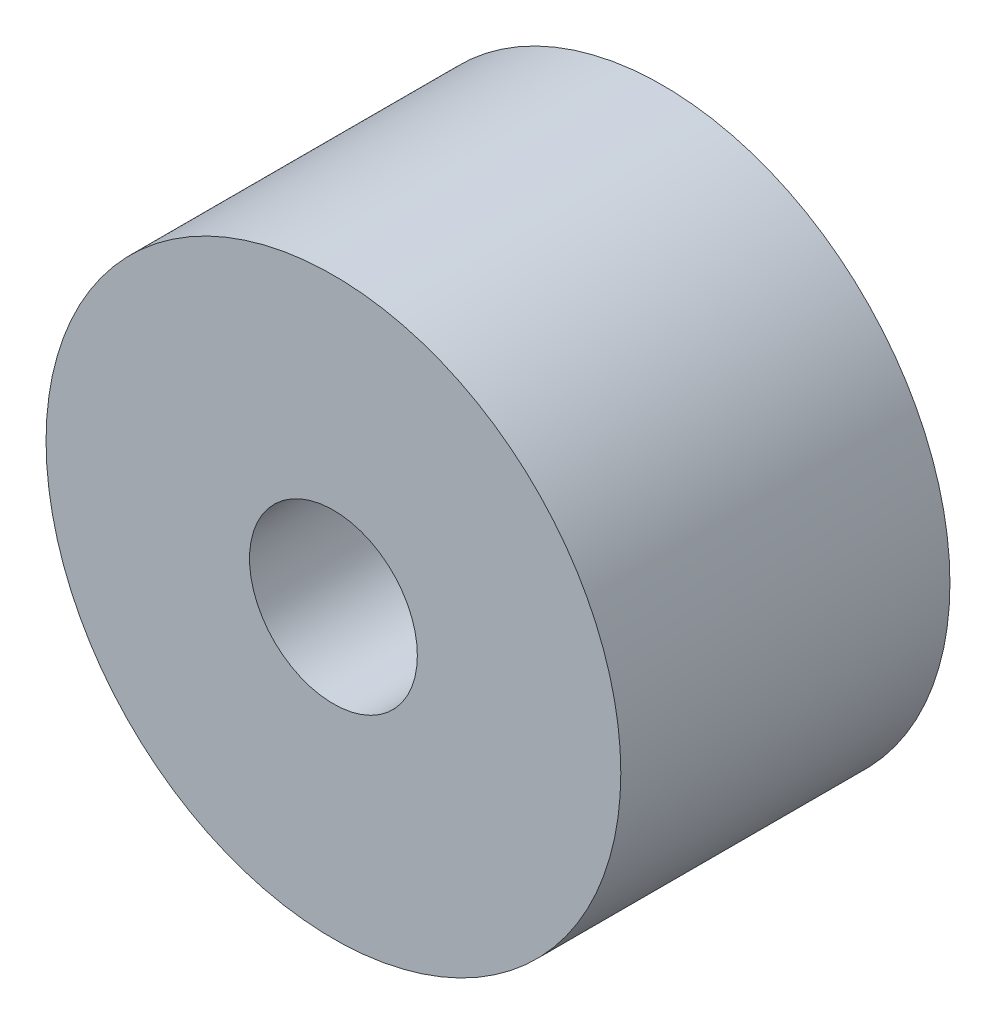
ISO-10303-21;
HEADER;
FILE_DESCRIPTION(('STEP AP214'),'2;1');
FILE_NAME('part.step','',(''),(''),'','','');
FILE_SCHEMA(('AUTOMOTIVE_DESIGN { 1 0 10303 214 1 1 1 1 }'));
ENDSEC;
DATA;
#1=APPLICATION_CONTEXT('core data for automotive mechanical design processes');
#2=APPLICATION_PROTOCOL_DEFINITION('international standard','automotive_design',2000,#1);
#3=PRODUCT_CONTEXT('',#1,'mechanical');
#4=PRODUCT('Part','Part','',(#3));
#5=PRODUCT_RELATED_PRODUCT_CATEGORY('part','',(#4));
#6=PRODUCT_DEFINITION_FORMATION('','',#4);
#7=PRODUCT_DEFINITION_CONTEXT('part definition',#1,'design');
#8=PRODUCT_DEFINITION('design','',#6,#7);
#9=PRODUCT_DEFINITION_SHAPE('','',#8);
#10=(LENGTH_UNIT() NAMED_UNIT(*) SI_UNIT(.MILLI.,.METRE.));
#11=(NAMED_UNIT(*) PLANE_ANGLE_UNIT() SI_UNIT($,.RADIAN.));
#12=(NAMED_UNIT(*) SI_UNIT($,.STERADIAN.) SOLID_ANGLE_UNIT());
#13=UNCERTAINTY_MEASURE_WITH_UNIT(LENGTH_MEASURE(1.E-05),#10,'distance_accuracy_value','');
#14=(GEOMETRIC_REPRESENTATION_CONTEXT(3) GLOBAL_UNCERTAINTY_ASSIGNED_CONTEXT((#13)) GLOBAL_UNIT_ASSIGNED_CONTEXT((#10,
#11,#12)) REPRESENTATION_CONTEXT('',''));
#15=CARTESIAN_POINT('',(0.,0.,0.));
#16=DIRECTION('',(0.,0.,1.));
#17=DIRECTION('',(1.,0.,0.));
#18=AXIS2_PLACEMENT_3D('',#15,#16,#17);
#19=CARTESIAN_POINT('',(0.,0.,10.));
#20=DIRECTION('',(0.,0.,1.));
#21=DIRECTION('',(1.,0.,0.));
#22=AXIS2_PLACEMENT_3D('',#19,#20,#21);
#23=PLANE('',#22);
#24=CARTESIAN_POINT('',(0.,0.,10.));
#25=DIRECTION('',(0.,0.,1.));
#26=DIRECTION('',(1.,0.,0.));
#27=AXIS2_PLACEMENT_3D('',#24,#25,#26);
#28=CIRCLE('',#27,8.73125);
#29=CARTESIAN_POINT('',(8.73125,0.,10.));
#30=VERTEX_POINT('',#29);
#31=EDGE_CURVE('E10',#30,#30,#28,.T.);
#32=ORIENTED_EDGE('',*,*,#31,.T.);
#33=EDGE_LOOP('',(#32));
#34=FACE_BOUND('',#33,.T.);
#35=CARTESIAN_POINT('',(0.,0.,10.));
#36=DIRECTION('',(0.,0.,1.));
#37=DIRECTION('',(1.,0.,0.));
#38=AXIS2_PLACEMENT_3D('',#35,#36,#37);
#39=CIRCLE('',#38,2.55);
#40=CARTESIAN_POINT('',(2.55,0.,10.));
#41=VERTEX_POINT('',#40);
#42=EDGE_CURVE('E41',#41,#41,#39,.T.);
#43=ORIENTED_EDGE('',*,*,#42,.F.);
#44=EDGE_LOOP('',(#43));
#45=FACE_BOUND('',#44,.T.);
#46=ADVANCED_FACE('F30',(#34,#45),#23,.T.);
#47=CARTESIAN_POINT('',(0.,0.,0.));
#48=DIRECTION('',(0.,0.,1.));
#49=DIRECTION('',(1.,0.,0.));
#50=AXIS2_PLACEMENT_3D('',#47,#48,#49);
#51=PLANE('',#50);
#52=CARTESIAN_POINT('',(0.,0.,0.));
#53=DIRECTION('',(0.,0.,1.));
#54=DIRECTION('',(1.,0.,0.));
#55=AXIS2_PLACEMENT_3D('',#52,#53,#54);
#56=CIRCLE('',#55,8.73125);
#57=CARTESIAN_POINT('',(8.73125,0.,0.));
#58=VERTEX_POINT('',#57);
#59=EDGE_CURVE('E34',#58,#58,#56,.T.);
#60=ORIENTED_EDGE('',*,*,#59,.F.);
#61=EDGE_LOOP('',(#60));
#62=FACE_BOUND('',#61,.T.);
#63=CARTESIAN_POINT('',(0.,0.,0.));
#64=DIRECTION('',(0.,0.,1.));
#65=DIRECTION('',(1.,0.,0.));
#66=AXIS2_PLACEMENT_3D('',#63,#64,#65);
#67=CIRCLE('',#66,2.55);
#68=CARTESIAN_POINT('',(2.55,0.,0.));
#69=VERTEX_POINT('',#68);
#70=EDGE_CURVE('E43',#69,#69,#67,.T.);
#71=ORIENTED_EDGE('',*,*,#70,.T.);
#72=EDGE_LOOP('',(#71));
#73=FACE_BOUND('',#72,.T.);
#74=ADVANCED_FACE('F53',(#62,#73),#51,.F.);
#75=CARTESIAN_POINT('',(0.,0.,10.));
#76=DIRECTION('',(0.,0.,-1.));
#77=DIRECTION('',(-1.,0.,0.));
#78=AXIS2_PLACEMENT_3D('',#75,#76,#77);
#79=CYLINDRICAL_SURFACE('',#78,8.73125);
#80=ORIENTED_EDGE('',*,*,#31,.F.);
#81=EDGE_LOOP('',(#80));
#82=FACE_BOUND('',#81,.T.);
#83=ORIENTED_EDGE('',*,*,#59,.T.);
#84=EDGE_LOOP('',(#83));
#85=FACE_BOUND('',#84,.T.);
#86=ADVANCED_FACE('F32',(#82,#85),#79,.T.);
#87=CARTESIAN_POINT('',(0.,0.,10.));
#88=DIRECTION('',(0.,0.,-1.));
#89=DIRECTION('',(-1.,0.,0.));
#90=AXIS2_PLACEMENT_3D('',#87,#88,#89);
#91=CYLINDRICAL_SURFACE('',#90,2.55);
#92=ORIENTED_EDGE('',*,*,#42,.T.);
#93=EDGE_LOOP('',(#92));
#94=FACE_BOUND('',#93,.T.);
#95=ORIENTED_EDGE('',*,*,#70,.F.);
#96=EDGE_LOOP('',(#95));
#97=FACE_BOUND('',#96,.T.);
#98=ADVANCED_FACE('F49',(#94,#97),#91,.F.);
#99=CLOSED_SHELL('',(#46,#74,#86,#98));
#100=MANIFOLD_SOLID_BREP('B2',#99);
#101=ADVANCED_BREP_SHAPE_REPRESENTATION('',(#18,#100),#14);
#102=SHAPE_DEFINITION_REPRESENTATION(#9,#101);
ENDSEC;
END-ISO-10303-21;
